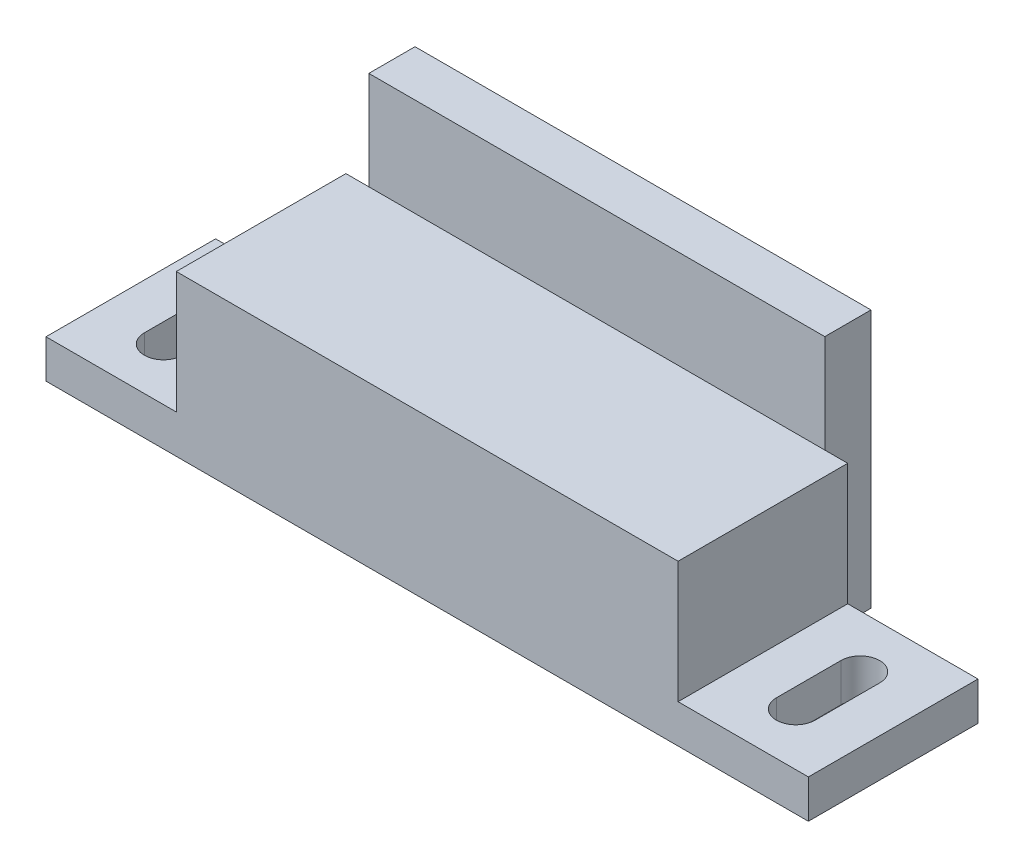
ISO-10303-21;
HEADER;
FILE_DESCRIPTION(('STEP AP214'),'2;1');
FILE_NAME('part.step','',(''),(''),'','','');
FILE_SCHEMA(('AUTOMOTIVE_DESIGN { 1 0 10303 214 1 1 1 1 }'));
ENDSEC;
DATA;
#1=APPLICATION_CONTEXT('core data for automotive mechanical design processes');
#2=APPLICATION_PROTOCOL_DEFINITION('international standard','automotive_design',2000,#1);
#3=PRODUCT_CONTEXT('',#1,'mechanical');
#4=PRODUCT('Part','Part','',(#3));
#5=PRODUCT_RELATED_PRODUCT_CATEGORY('part','',(#4));
#6=PRODUCT_DEFINITION_FORMATION('','',#4);
#7=PRODUCT_DEFINITION_CONTEXT('part definition',#1,'design');
#8=PRODUCT_DEFINITION('design','',#6,#7);
#9=PRODUCT_DEFINITION_SHAPE('','',#8);
#10=(LENGTH_UNIT() NAMED_UNIT(*) SI_UNIT(.MILLI.,.METRE.));
#11=(NAMED_UNIT(*) PLANE_ANGLE_UNIT() SI_UNIT($,.RADIAN.));
#12=(NAMED_UNIT(*) SI_UNIT($,.STERADIAN.) SOLID_ANGLE_UNIT());
#13=UNCERTAINTY_MEASURE_WITH_UNIT(LENGTH_MEASURE(1.E-05),#10,'distance_accuracy_value','');
#14=(GEOMETRIC_REPRESENTATION_CONTEXT(3) GLOBAL_UNCERTAINTY_ASSIGNED_CONTEXT((#13)) GLOBAL_UNIT_ASSIGNED_CONTEXT((#10,
#11,#12)) REPRESENTATION_CONTEXT('',''));
#15=CARTESIAN_POINT('',(0.,0.,0.));
#16=DIRECTION('',(0.,0.,1.));
#17=DIRECTION('',(1.,0.,0.));
#18=AXIS2_PLACEMENT_3D('',#15,#16,#17);
#19=CARTESIAN_POINT('',(0.,0.,-6.1087));
#20=DIRECTION('',(0.,0.,1.));
#21=DIRECTION('',(1.,0.,0.));
#22=AXIS2_PLACEMENT_3D('',#19,#20,#21);
#23=PLANE('',#22);
#24=DIRECTION('',(0.,-1.,0.));
#25=VECTOR('',#24,1.);
#26=CARTESIAN_POINT('',(16.4211,0.,-6.1087));
#27=LINE('',#26,#25);
#28=CARTESIAN_POINT('',(16.4211,11.5316,-6.1087));
#29=VERTEX_POINT('',#28);
#30=CARTESIAN_POINT('',(16.4211,0.,-6.1087));
#31=VERTEX_POINT('',#30);
#32=EDGE_CURVE('E11',#29,#31,#27,.T.);
#33=ORIENTED_EDGE('',*,*,#32,.F.);
#34=DIRECTION('',(-1.,0.,0.));
#35=VECTOR('',#34,1.);
#36=CARTESIAN_POINT('',(18.0721,11.5316,-6.1087));
#37=LINE('',#36,#35);
#38=CARTESIAN_POINT('',(18.0721,11.5316,-6.1087));
#39=VERTEX_POINT('',#38);
#40=EDGE_CURVE('E303',#39,#29,#37,.T.);
#41=ORIENTED_EDGE('',*,*,#40,.F.);
#42=DIRECTION('',(0.,1.,0.));
#43=VECTOR('',#42,1.);
#44=CARTESIAN_POINT('',(18.0721,2.76860000000001,-6.1087));
#45=LINE('',#44,#43);
#46=CARTESIAN_POINT('',(18.0721,2.76860000000001,-6.1087));
#47=VERTEX_POINT('',#46);
#48=EDGE_CURVE('E300',#47,#39,#45,.T.);
#49=ORIENTED_EDGE('',*,*,#48,.F.);
#50=DIRECTION('',(-1.,0.,0.));
#51=VECTOR('',#50,1.);
#52=CARTESIAN_POINT('',(27.4574,2.76860000000001,-6.1087));
#53=LINE('',#52,#51);
#54=CARTESIAN_POINT('',(27.4574,2.76860000000001,-6.1087));
#55=VERTEX_POINT('',#54);
#56=EDGE_CURVE('E298',#55,#47,#53,.T.);
#57=ORIENTED_EDGE('',*,*,#56,.F.);
#58=DIRECTION('',(0.,1.,0.));
#59=VECTOR('',#58,1.);
#60=CARTESIAN_POINT('',(27.4574,0.,-6.1087));
#61=LINE('',#60,#59);
#62=CARTESIAN_POINT('',(27.4574,0.,-6.1087));
#63=VERTEX_POINT('',#62);
#64=EDGE_CURVE('E296',#63,#55,#61,.T.);
#65=ORIENTED_EDGE('',*,*,#64,.F.);
#66=DIRECTION('',(1.,0.,0.));
#67=VECTOR('',#66,1.);
#68=CARTESIAN_POINT('',(-27.4574,0.,-6.1087));
#69=LINE('',#68,#67);
#70=EDGE_CURVE('E52',#31,#63,#69,.T.);
#71=ORIENTED_EDGE('',*,*,#70,.F.);
#72=EDGE_LOOP('',(#33,#41,#49,#57,#65,#71));
#73=FACE_BOUND('',#72,.T.);
#74=ADVANCED_FACE('F35',(#73),#23,.F.);
#75=DIRECTION('',(0.,1.,0.));
#76=VECTOR('',#75,1.);
#77=CARTESIAN_POINT('',(-16.4211,18.6086769877465,-6.1087));
#78=LINE('',#77,#76);
#79=CARTESIAN_POINT('',(-16.4211,0.,-6.1087));
#80=VERTEX_POINT('',#79);
#81=CARTESIAN_POINT('',(-16.4211,11.5316,-6.1087));
#82=VERTEX_POINT('',#81);
#83=EDGE_CURVE('E59',#80,#82,#78,.T.);
#84=ORIENTED_EDGE('',*,*,#83,.F.);
#85=CARTESIAN_POINT('',(-27.4574,0.,-6.1087));
#86=VERTEX_POINT('',#85);
#87=EDGE_CURVE('E294',#86,#80,#69,.T.);
#88=ORIENTED_EDGE('',*,*,#87,.F.);
#89=DIRECTION('',(0.,-1.,0.));
#90=VECTOR('',#89,1.);
#91=CARTESIAN_POINT('',(-27.4574,2.7686,-6.1087));
#92=LINE('',#91,#90);
#93=CARTESIAN_POINT('',(-27.4574,2.7686,-6.1087));
#94=VERTEX_POINT('',#93);
#95=EDGE_CURVE('E238',#94,#86,#92,.T.);
#96=ORIENTED_EDGE('',*,*,#95,.F.);
#97=DIRECTION('',(-1.,0.,0.));
#98=VECTOR('',#97,1.);
#99=CARTESIAN_POINT('',(-18.0721,2.7686,-6.1087));
#100=LINE('',#99,#98);
#101=CARTESIAN_POINT('',(-18.0721,2.7686,-6.1087));
#102=VERTEX_POINT('',#101);
#103=EDGE_CURVE('E277',#102,#94,#100,.T.);
#104=ORIENTED_EDGE('',*,*,#103,.F.);
#105=DIRECTION('',(0.,-1.,0.));
#106=VECTOR('',#105,1.);
#107=CARTESIAN_POINT('',(-18.0721,11.5316,-6.1087));
#108=LINE('',#107,#106);
#109=CARTESIAN_POINT('',(-18.0721,11.5316,-6.1087));
#110=VERTEX_POINT('',#109);
#111=EDGE_CURVE('E306',#110,#102,#108,.T.);
#112=ORIENTED_EDGE('',*,*,#111,.F.);
#113=EDGE_CURVE('E302',#82,#110,#37,.T.);
#114=ORIENTED_EDGE('',*,*,#113,.F.);
#115=EDGE_LOOP('',(#84,#88,#96,#104,#112,#114));
#116=FACE_BOUND('',#115,.T.);
#117=ADVANCED_FACE('F338',(#116),#23,.F.);
#118=CARTESIAN_POINT('',(-27.4574,2.7686,6.1087));
#119=DIRECTION('',(1.,0.,0.));
#120=DIRECTION('',(0.,0.,-1.));
#121=AXIS2_PLACEMENT_3D('',#118,#119,#120);
#122=PLANE('',#121);
#123=ORIENTED_EDGE('',*,*,#95,.T.);
#124=DIRECTION('',(0.,0.,-1.));
#125=VECTOR('',#124,1.);
#126=CARTESIAN_POINT('',(-27.4574,0.,6.1087));
#127=LINE('',#126,#125);
#128=CARTESIAN_POINT('',(-27.4574,0.,6.1087));
#129=VERTEX_POINT('',#128);
#130=EDGE_CURVE('E39',#129,#86,#127,.T.);
#131=ORIENTED_EDGE('',*,*,#130,.F.);
#132=DIRECTION('',(0.,-1.,0.));
#133=VECTOR('',#132,1.);
#134=CARTESIAN_POINT('',(-27.4574,2.7686,6.1087));
#135=LINE('',#134,#133);
#136=CARTESIAN_POINT('',(-27.4574,2.7686,6.1087));
#137=VERTEX_POINT('',#136);
#138=EDGE_CURVE('E273',#137,#129,#135,.T.);
#139=ORIENTED_EDGE('',*,*,#138,.F.);
#140=DIRECTION('',(0.,0.,-1.));
#141=VECTOR('',#140,1.);
#142=CARTESIAN_POINT('',(-27.4574,2.7686,6.1087));
#143=LINE('',#142,#141);
#144=EDGE_CURVE('E291',#137,#94,#143,.T.);
#145=ORIENTED_EDGE('',*,*,#144,.T.);
#146=EDGE_LOOP('',(#123,#131,#139,#145));
#147=FACE_BOUND('',#146,.T.);
#148=ADVANCED_FACE('F37',(#147),#122,.F.);
#149=CARTESIAN_POINT('',(-27.4574,0.,6.1087));
#150=DIRECTION('',(0.,1.,0.));
#151=DIRECTION('',(-1.,0.,0.));
#152=AXIS2_PLACEMENT_3D('',#149,#150,#151);
#153=PLANE('',#152);
#154=DIRECTION('',(0.,0.,-1.));
#155=VECTOR('',#154,1.);
#156=CARTESIAN_POINT('',(-21.36775,0.,-2.3241));
#157=LINE('',#156,#155);
#158=CARTESIAN_POINT('',(-21.36775,0.,2.3241));
#159=VERTEX_POINT('',#158);
#160=CARTESIAN_POINT('',(-21.36775,0.,-2.3241));
#161=VERTEX_POINT('',#160);
#162=EDGE_CURVE('E221',#159,#161,#157,.T.);
#163=ORIENTED_EDGE('',*,*,#162,.T.);
#164=CARTESIAN_POINT('',(-22.76475,0.,-2.3241));
#165=DIRECTION('',(0.,1.,0.));
#166=DIRECTION('',(-1.,0.,0.));
#167=AXIS2_PLACEMENT_3D('',#164,#165,#166);
#168=CIRCLE('',#167,1.397);
#169=CARTESIAN_POINT('',(-24.16175,0.,-2.3241));
#170=VERTEX_POINT('',#169);
#171=EDGE_CURVE('E211',#161,#170,#168,.T.);
#172=ORIENTED_EDGE('',*,*,#171,.T.);
#173=DIRECTION('',(0.,0.,1.));
#174=VECTOR('',#173,1.);
#175=CARTESIAN_POINT('',(-24.16175,0.,-2.3241));
#176=LINE('',#175,#174);
#177=CARTESIAN_POINT('',(-24.16175,0.,2.3241));
#178=VERTEX_POINT('',#177);
#179=EDGE_CURVE('E214',#170,#178,#176,.T.);
#180=ORIENTED_EDGE('',*,*,#179,.T.);
#181=CARTESIAN_POINT('',(-22.76475,0.,2.3241));
#182=DIRECTION('',(0.,1.,0.));
#183=DIRECTION('',(-1.,0.,0.));
#184=AXIS2_PLACEMENT_3D('',#181,#182,#183);
#185=CIRCLE('',#184,1.397);
#186=EDGE_CURVE('E218',#178,#159,#185,.T.);
#187=ORIENTED_EDGE('',*,*,#186,.T.);
#188=EDGE_LOOP('',(#163,#172,#180,#187));
#189=FACE_BOUND('',#188,.T.);
#190=DIRECTION('',(0.,0.,-1.));
#191=VECTOR('',#190,1.);
#192=CARTESIAN_POINT('',(24.16175,0.,-2.3241));
#193=LINE('',#192,#191);
#194=CARTESIAN_POINT('',(24.16175,0.,2.3241));
#195=VERTEX_POINT('',#194);
#196=CARTESIAN_POINT('',(24.16175,0.,-2.3241));
#197=VERTEX_POINT('',#196);
#198=EDGE_CURVE('E255',#195,#197,#193,.T.);
#199=ORIENTED_EDGE('',*,*,#198,.T.);
#200=CARTESIAN_POINT('',(22.76475,0.,-2.3241));
#201=DIRECTION('',(0.,1.,0.));
#202=DIRECTION('',(1.,0.,0.));
#203=AXIS2_PLACEMENT_3D('',#200,#201,#202);
#204=CIRCLE('',#203,1.397);
#205=CARTESIAN_POINT('',(21.36775,0.,-2.3241));
#206=VERTEX_POINT('',#205);
#207=EDGE_CURVE('E245',#197,#206,#204,.T.);
#208=ORIENTED_EDGE('',*,*,#207,.T.);
#209=DIRECTION('',(0.,0.,1.));
#210=VECTOR('',#209,1.);
#211=CARTESIAN_POINT('',(21.36775,0.,-2.3241));
#212=LINE('',#211,#210);
#213=CARTESIAN_POINT('',(21.36775,0.,2.3241));
#214=VERTEX_POINT('',#213);
#215=EDGE_CURVE('E248',#206,#214,#212,.T.);
#216=ORIENTED_EDGE('',*,*,#215,.T.);
#217=CARTESIAN_POINT('',(22.76475,0.,2.3241));
#218=DIRECTION('',(0.,1.,0.));
#219=DIRECTION('',(1.,0.,0.));
#220=AXIS2_PLACEMENT_3D('',#217,#218,#219);
#221=CIRCLE('',#220,1.397);
#222=EDGE_CURVE('E252',#214,#195,#221,.T.);
#223=ORIENTED_EDGE('',*,*,#222,.T.);
#224=EDGE_LOOP('',(#199,#208,#216,#223));
#225=FACE_BOUND('',#224,.T.);
#226=ORIENTED_EDGE('',*,*,#87,.T.);
#227=DIRECTION('',(0.,0.,1.));
#228=VECTOR('',#227,1.);
#229=CARTESIAN_POINT('',(-16.4211,0.,-9.4361));
#230=LINE('',#229,#228);
#231=CARTESIAN_POINT('',(-16.4211,0.,-9.4361));
#232=VERTEX_POINT('',#231);
#233=EDGE_CURVE('E186',#232,#80,#230,.T.);
#234=ORIENTED_EDGE('',*,*,#233,.F.);
#235=DIRECTION('',(-1.,0.,0.));
#236=VECTOR('',#235,1.);
#237=CARTESIAN_POINT('',(16.4211,0.,-9.4361));
#238=LINE('',#237,#236);
#239=CARTESIAN_POINT('',(16.4211,0.,-9.4361));
#240=VERTEX_POINT('',#239);
#241=EDGE_CURVE('E180',#240,#232,#238,.T.);
#242=ORIENTED_EDGE('',*,*,#241,.F.);
#243=DIRECTION('',(0.,0.,1.));
#244=VECTOR('',#243,1.);
#245=CARTESIAN_POINT('',(16.4211,0.,-9.4361));
#246=LINE('',#245,#244);
#247=EDGE_CURVE('E184',#240,#31,#246,.T.);
#248=ORIENTED_EDGE('',*,*,#247,.T.);
#249=ORIENTED_EDGE('',*,*,#70,.T.);
#250=DIRECTION('',(0.,0.,-1.));
#251=VECTOR('',#250,1.);
#252=CARTESIAN_POINT('',(27.4574,0.,6.1087));
#253=LINE('',#252,#251);
#254=CARTESIAN_POINT('',(27.4574,0.,6.1087));
#255=VERTEX_POINT('',#254);
#256=EDGE_CURVE('E326',#255,#63,#253,.T.);
#257=ORIENTED_EDGE('',*,*,#256,.F.);
#258=DIRECTION('',(1.,0.,0.));
#259=VECTOR('',#258,1.);
#260=CARTESIAN_POINT('',(-27.4574,0.,6.1087));
#261=LINE('',#260,#259);
#262=EDGE_CURVE('E276',#129,#255,#261,.T.);
#263=ORIENTED_EDGE('',*,*,#262,.F.);
#264=ORIENTED_EDGE('',*,*,#130,.T.);
#265=EDGE_LOOP('',(#226,#234,#242,#248,#249,#257,#263,#264));
#266=FACE_BOUND('',#265,.T.);
#267=ADVANCED_FACE('F182',(#189,#225,#266),#153,.F.);
#268=CARTESIAN_POINT('',(27.4574,0.,6.1087));
#269=DIRECTION('',(-1.,0.,0.));
#270=DIRECTION('',(0.,0.,1.));
#271=AXIS2_PLACEMENT_3D('',#268,#269,#270);
#272=PLANE('',#271);
#273=ORIENTED_EDGE('',*,*,#64,.T.);
#274=DIRECTION('',(0.,0.,-1.));
#275=VECTOR('',#274,1.);
#276=CARTESIAN_POINT('',(27.4574,2.76860000000001,6.1087));
#277=LINE('',#276,#275);
#278=CARTESIAN_POINT('',(27.4574,2.76860000000001,6.1087));
#279=VERTEX_POINT('',#278);
#280=EDGE_CURVE('E324',#279,#55,#277,.T.);
#281=ORIENTED_EDGE('',*,*,#280,.F.);
#282=DIRECTION('',(0.,1.,0.));
#283=VECTOR('',#282,1.);
#284=CARTESIAN_POINT('',(27.4574,0.,6.1087));
#285=LINE('',#284,#283);
#286=EDGE_CURVE('E279',#255,#279,#285,.T.);
#287=ORIENTED_EDGE('',*,*,#286,.F.);
#288=ORIENTED_EDGE('',*,*,#256,.T.);
#289=EDGE_LOOP('',(#273,#281,#287,#288));
#290=FACE_BOUND('',#289,.T.);
#291=ADVANCED_FACE('F402',(#290),#272,.F.);
#292=CARTESIAN_POINT('',(27.4574,2.76860000000001,6.1087));
#293=DIRECTION('',(0.,-1.,0.));
#294=DIRECTION('',(1.,0.,0.));
#295=AXIS2_PLACEMENT_3D('',#292,#293,#294);
#296=PLANE('',#295);
#297=DIRECTION('',(0.,0.,1.));
#298=VECTOR('',#297,1.);
#299=CARTESIAN_POINT('',(21.36775,2.76860000000002,-2.3241));
#300=LINE('',#299,#298);
#301=CARTESIAN_POINT('',(21.36775,2.76860000000001,-2.3241));
#302=VERTEX_POINT('',#301);
#303=CARTESIAN_POINT('',(21.36775,2.76860000000002,2.3241));
#304=VERTEX_POINT('',#303);
#305=EDGE_CURVE('E205',#302,#304,#300,.T.);
#306=ORIENTED_EDGE('',*,*,#305,.F.);
#307=CARTESIAN_POINT('',(22.76475,2.76860000000003,-2.3241));
#308=DIRECTION('',(0.,1.,0.));
#309=DIRECTION('',(1.,0.,0.));
#310=AXIS2_PLACEMENT_3D('',#307,#308,#309);
#311=CIRCLE('',#310,1.397);
#312=CARTESIAN_POINT('',(24.16175,2.76860000000003,-2.3241));
#313=VERTEX_POINT('',#312);
#314=EDGE_CURVE('E203',#313,#302,#311,.T.);
#315=ORIENTED_EDGE('',*,*,#314,.F.);
#316=DIRECTION('',(0.,0.,-1.));
#317=VECTOR('',#316,1.);
#318=CARTESIAN_POINT('',(24.16175,2.76860000000003,-2.3241));
#319=LINE('',#318,#317);
#320=CARTESIAN_POINT('',(24.16175,2.76860000000003,2.3241));
#321=VERTEX_POINT('',#320);
#322=EDGE_CURVE('E249',#321,#313,#319,.T.);
#323=ORIENTED_EDGE('',*,*,#322,.F.);
#324=CARTESIAN_POINT('',(22.76475,2.76860000000003,2.3241));
#325=DIRECTION('',(0.,1.,0.));
#326=DIRECTION('',(1.,0.,0.));
#327=AXIS2_PLACEMENT_3D('',#324,#325,#326);
#328=CIRCLE('',#327,1.397);
#329=EDGE_CURVE('E261',#304,#321,#328,.T.);
#330=ORIENTED_EDGE('',*,*,#329,.F.);
#331=EDGE_LOOP('',(#306,#315,#323,#330));
#332=FACE_BOUND('',#331,.T.);
#333=ORIENTED_EDGE('',*,*,#56,.T.);
#334=DIRECTION('',(0.,0.,-1.));
#335=VECTOR('',#334,1.);
#336=CARTESIAN_POINT('',(18.0721,2.76860000000001,6.1087));
#337=LINE('',#336,#335);
#338=CARTESIAN_POINT('',(18.0721,2.76860000000001,6.1087));
#339=VERTEX_POINT('',#338);
#340=EDGE_CURVE('E321',#339,#47,#337,.T.);
#341=ORIENTED_EDGE('',*,*,#340,.F.);
#342=DIRECTION('',(-1.,0.,0.));
#343=VECTOR('',#342,1.);
#344=CARTESIAN_POINT('',(27.4574,2.76860000000001,6.1087));
#345=LINE('',#344,#343);
#346=EDGE_CURVE('E281',#279,#339,#345,.T.);
#347=ORIENTED_EDGE('',*,*,#346,.F.);
#348=ORIENTED_EDGE('',*,*,#280,.T.);
#349=EDGE_LOOP('',(#333,#341,#347,#348));
#350=FACE_BOUND('',#349,.T.);
#351=ADVANCED_FACE('F398',(#332,#350),#296,.F.);
#352=CARTESIAN_POINT('',(18.0721,2.76860000000001,6.1087));
#353=DIRECTION('',(-1.,0.,0.));
#354=DIRECTION('',(0.,0.,1.));
#355=AXIS2_PLACEMENT_3D('',#352,#353,#354);
#356=PLANE('',#355);
#357=ORIENTED_EDGE('',*,*,#48,.T.);
#358=DIRECTION('',(0.,0.,-1.));
#359=VECTOR('',#358,1.);
#360=CARTESIAN_POINT('',(18.0721,11.5316,6.1087));
#361=LINE('',#360,#359);
#362=CARTESIAN_POINT('',(18.0721,11.5316,6.1087));
#363=VERTEX_POINT('',#362);
#364=EDGE_CURVE('E318',#363,#39,#361,.T.);
#365=ORIENTED_EDGE('',*,*,#364,.F.);
#366=DIRECTION('',(0.,1.,0.));
#367=VECTOR('',#366,1.);
#368=CARTESIAN_POINT('',(18.0721,2.76860000000001,6.1087));
#369=LINE('',#368,#367);
#370=EDGE_CURVE('E283',#339,#363,#369,.T.);
#371=ORIENTED_EDGE('',*,*,#370,.F.);
#372=ORIENTED_EDGE('',*,*,#340,.T.);
#373=EDGE_LOOP('',(#357,#365,#371,#372));
#374=FACE_BOUND('',#373,.T.);
#375=ADVANCED_FACE('F395',(#374),#356,.F.);
#376=CARTESIAN_POINT('',(18.0721,11.5316,6.1087));
#377=DIRECTION('',(0.,-1.,0.));
#378=DIRECTION('',(0.,0.,-1.));
#379=AXIS2_PLACEMENT_3D('',#376,#377,#378);
#380=PLANE('',#379);
#381=ORIENTED_EDGE('',*,*,#40,.T.);
#382=EDGE_CURVE('E307',#29,#82,#37,.T.);
#383=ORIENTED_EDGE('',*,*,#382,.T.);
#384=ORIENTED_EDGE('',*,*,#113,.T.);
#385=DIRECTION('',(0.,0.,-1.));
#386=VECTOR('',#385,1.);
#387=CARTESIAN_POINT('',(-18.0721,11.5316,6.1087));
#388=LINE('',#387,#386);
#389=CARTESIAN_POINT('',(-18.0721,11.5316,6.1087));
#390=VERTEX_POINT('',#389);
#391=EDGE_CURVE('E315',#390,#110,#388,.T.);
#392=ORIENTED_EDGE('',*,*,#391,.F.);
#393=DIRECTION('',(-1.,0.,0.));
#394=VECTOR('',#393,1.);
#395=CARTESIAN_POINT('',(18.0721,11.5316,6.1087));
#396=LINE('',#395,#394);
#397=EDGE_CURVE('E285',#363,#390,#396,.T.);
#398=ORIENTED_EDGE('',*,*,#397,.F.);
#399=ORIENTED_EDGE('',*,*,#364,.T.);
#400=EDGE_LOOP('',(#381,#383,#384,#392,#398,#399));
#401=FACE_BOUND('',#400,.T.);
#402=ADVANCED_FACE('F350',(#401),#380,.F.);
#403=CARTESIAN_POINT('',(-18.0721,11.5316,6.1087));
#404=DIRECTION('',(1.,0.,0.));
#405=DIRECTION('',(0.,0.,-1.));
#406=AXIS2_PLACEMENT_3D('',#403,#404,#405);
#407=PLANE('',#406);
#408=ORIENTED_EDGE('',*,*,#111,.T.);
#409=DIRECTION('',(0.,0.,-1.));
#410=VECTOR('',#409,1.);
#411=CARTESIAN_POINT('',(-18.0721,2.7686,6.1087));
#412=LINE('',#411,#410);
#413=CARTESIAN_POINT('',(-18.0721,2.7686,6.1087));
#414=VERTEX_POINT('',#413);
#415=EDGE_CURVE('E312',#414,#102,#412,.T.);
#416=ORIENTED_EDGE('',*,*,#415,.F.);
#417=DIRECTION('',(0.,-1.,0.));
#418=VECTOR('',#417,1.);
#419=CARTESIAN_POINT('',(-18.0721,11.5316,6.1087));
#420=LINE('',#419,#418);
#421=EDGE_CURVE('E287',#390,#414,#420,.T.);
#422=ORIENTED_EDGE('',*,*,#421,.F.);
#423=ORIENTED_EDGE('',*,*,#391,.T.);
#424=EDGE_LOOP('',(#408,#416,#422,#423));
#425=FACE_BOUND('',#424,.T.);
#426=ADVANCED_FACE('F346',(#425),#407,.F.);
#427=CARTESIAN_POINT('',(-18.0721,2.7686,6.1087));
#428=DIRECTION('',(0.,-1.,0.));
#429=DIRECTION('',(1.,0.,0.));
#430=AXIS2_PLACEMENT_3D('',#427,#428,#429);
#431=PLANE('',#430);
#432=DIRECTION('',(0.,0.,1.));
#433=VECTOR('',#432,1.);
#434=CARTESIAN_POINT('',(-24.16175,2.7686,-2.3241));
#435=LINE('',#434,#433);
#436=CARTESIAN_POINT('',(-24.16175,2.7686,-2.3241));
#437=VERTEX_POINT('',#436);
#438=CARTESIAN_POINT('',(-24.16175,2.7686,2.3241));
#439=VERTEX_POINT('',#438);
#440=EDGE_CURVE('E227',#437,#439,#435,.T.);
#441=ORIENTED_EDGE('',*,*,#440,.F.);
#442=CARTESIAN_POINT('',(-22.76475,2.7686,-2.3241));
#443=DIRECTION('',(0.,1.,0.));
#444=DIRECTION('',(-1.,0.,0.));
#445=AXIS2_PLACEMENT_3D('',#442,#443,#444);
#446=CIRCLE('',#445,1.397);
#447=CARTESIAN_POINT('',(-21.36775,2.7686,-2.3241));
#448=VERTEX_POINT('',#447);
#449=EDGE_CURVE('E225',#448,#437,#446,.T.);
#450=ORIENTED_EDGE('',*,*,#449,.F.);
#451=DIRECTION('',(0.,0.,-1.));
#452=VECTOR('',#451,1.);
#453=CARTESIAN_POINT('',(-21.36775,2.7686,-2.3241));
#454=LINE('',#453,#452);
#455=CARTESIAN_POINT('',(-21.36775,2.7686,2.3241));
#456=VERTEX_POINT('',#455);
#457=EDGE_CURVE('E215',#456,#448,#454,.T.);
#458=ORIENTED_EDGE('',*,*,#457,.F.);
#459=CARTESIAN_POINT('',(-22.76475,2.7686,2.3241));
#460=DIRECTION('',(0.,1.,0.));
#461=DIRECTION('',(-1.,0.,0.));
#462=AXIS2_PLACEMENT_3D('',#459,#460,#461);
#463=CIRCLE('',#462,1.397);
#464=EDGE_CURVE('E231',#439,#456,#463,.T.);
#465=ORIENTED_EDGE('',*,*,#464,.F.);
#466=EDGE_LOOP('',(#441,#450,#458,#465));
#467=FACE_BOUND('',#466,.T.);
#468=ORIENTED_EDGE('',*,*,#103,.T.);
#469=ORIENTED_EDGE('',*,*,#144,.F.);
#470=DIRECTION('',(-1.,0.,0.));
#471=VECTOR('',#470,1.);
#472=CARTESIAN_POINT('',(-18.0721,2.7686,6.1087));
#473=LINE('',#472,#471);
#474=EDGE_CURVE('E289',#414,#137,#473,.T.);
#475=ORIENTED_EDGE('',*,*,#474,.F.);
#476=ORIENTED_EDGE('',*,*,#415,.T.);
#477=EDGE_LOOP('',(#468,#469,#475,#476));
#478=FACE_BOUND('',#477,.T.);
#479=ADVANCED_FACE('F341',(#467,#478),#431,.F.);
#480=CARTESIAN_POINT('',(0.,0.,6.1087));
#481=DIRECTION('',(0.,0.,1.));
#482=DIRECTION('',(1.,0.,0.));
#483=AXIS2_PLACEMENT_3D('',#480,#481,#482);
#484=PLANE('',#483);
#485=ORIENTED_EDGE('',*,*,#138,.T.);
#486=ORIENTED_EDGE('',*,*,#262,.T.);
#487=ORIENTED_EDGE('',*,*,#286,.T.);
#488=ORIENTED_EDGE('',*,*,#346,.T.);
#489=ORIENTED_EDGE('',*,*,#370,.T.);
#490=ORIENTED_EDGE('',*,*,#397,.T.);
#491=ORIENTED_EDGE('',*,*,#421,.T.);
#492=ORIENTED_EDGE('',*,*,#474,.T.);
#493=EDGE_LOOP('',(#485,#486,#487,#488,#489,#490,#491,#492));
#494=FACE_BOUND('',#493,.T.);
#495=ADVANCED_FACE('F386',(#494),#484,.T.);
#496=CARTESIAN_POINT('',(-22.76475,0.,-2.3241));
#497=DIRECTION('',(0.,1.,0.));
#498=DIRECTION('',(-1.,0.,0.));
#499=AXIS2_PLACEMENT_3D('',#496,#497,#498);
#500=CYLINDRICAL_SURFACE('',#499,1.397);
#501=ORIENTED_EDGE('',*,*,#449,.T.);
#502=DIRECTION('',(0.,1.,0.));
#503=VECTOR('',#502,1.);
#504=CARTESIAN_POINT('',(-24.16175,0.,-2.3241));
#505=LINE('',#504,#503);
#506=EDGE_CURVE('E224',#170,#437,#505,.T.);
#507=ORIENTED_EDGE('',*,*,#506,.F.);
#508=ORIENTED_EDGE('',*,*,#171,.F.);
#509=DIRECTION('',(0.,1.,0.));
#510=VECTOR('',#509,1.);
#511=CARTESIAN_POINT('',(-21.36775,0.,-2.3241));
#512=LINE('',#511,#510);
#513=EDGE_CURVE('E236',#161,#448,#512,.T.);
#514=ORIENTED_EDGE('',*,*,#513,.T.);
#515=EDGE_LOOP('',(#501,#507,#508,#514));
#516=FACE_BOUND('',#515,.T.);
#517=ADVANCED_FACE('F439',(#516),#500,.F.);
#518=CARTESIAN_POINT('',(-21.36775,0.,-2.3241));
#519=DIRECTION('',(1.,0.,0.));
#520=DIRECTION('',(0.,1.,0.));
#521=AXIS2_PLACEMENT_3D('',#518,#519,#520);
#522=PLANE('',#521);
#523=ORIENTED_EDGE('',*,*,#457,.T.);
#524=ORIENTED_EDGE('',*,*,#513,.F.);
#525=ORIENTED_EDGE('',*,*,#162,.F.);
#526=DIRECTION('',(0.,1.,0.));
#527=VECTOR('',#526,1.);
#528=CARTESIAN_POINT('',(-21.36775,0.,2.3241));
#529=LINE('',#528,#527);
#530=EDGE_CURVE('E239',#159,#456,#529,.T.);
#531=ORIENTED_EDGE('',*,*,#530,.T.);
#532=EDGE_LOOP('',(#523,#524,#525,#531));
#533=FACE_BOUND('',#532,.T.);
#534=ADVANCED_FACE('F443',(#533),#522,.F.);
#535=CARTESIAN_POINT('',(-22.76475,0.,2.3241));
#536=DIRECTION('',(0.,1.,0.));
#537=DIRECTION('',(-1.,0.,0.));
#538=AXIS2_PLACEMENT_3D('',#535,#536,#537);
#539=CYLINDRICAL_SURFACE('',#538,1.397);
#540=ORIENTED_EDGE('',*,*,#464,.T.);
#541=ORIENTED_EDGE('',*,*,#530,.F.);
#542=ORIENTED_EDGE('',*,*,#186,.F.);
#543=DIRECTION('',(0.,1.,0.));
#544=VECTOR('',#543,1.);
#545=CARTESIAN_POINT('',(-24.16175,0.,2.3241));
#546=LINE('',#545,#544);
#547=EDGE_CURVE('E241',#178,#439,#546,.T.);
#548=ORIENTED_EDGE('',*,*,#547,.T.);
#549=EDGE_LOOP('',(#540,#541,#542,#548));
#550=FACE_BOUND('',#549,.T.);
#551=ADVANCED_FACE('F449',(#550),#539,.F.);
#552=CARTESIAN_POINT('',(-24.16175,0.,-2.3241));
#553=DIRECTION('',(-1.,0.,0.));
#554=DIRECTION('',(0.,-1.,0.));
#555=AXIS2_PLACEMENT_3D('',#552,#553,#554);
#556=PLANE('',#555);
#557=ORIENTED_EDGE('',*,*,#440,.T.);
#558=ORIENTED_EDGE('',*,*,#547,.F.);
#559=ORIENTED_EDGE('',*,*,#179,.F.);
#560=ORIENTED_EDGE('',*,*,#506,.T.);
#561=EDGE_LOOP('',(#557,#558,#559,#560));
#562=FACE_BOUND('',#561,.T.);
#563=ADVANCED_FACE('F454',(#562),#556,.F.);
#564=CARTESIAN_POINT('',(22.76475,0.,-2.3241));
#565=DIRECTION('',(0.,1.,0.));
#566=DIRECTION('',(-1.,0.,0.));
#567=AXIS2_PLACEMENT_3D('',#564,#565,#566);
#568=CYLINDRICAL_SURFACE('',#567,1.397);
#569=ORIENTED_EDGE('',*,*,#314,.T.);
#570=DIRECTION('',(0.,1.,0.));
#571=VECTOR('',#570,1.);
#572=CARTESIAN_POINT('',(21.36775,0.,-2.3241));
#573=LINE('',#572,#571);
#574=EDGE_CURVE('E257',#206,#302,#573,.T.);
#575=ORIENTED_EDGE('',*,*,#574,.F.);
#576=ORIENTED_EDGE('',*,*,#207,.F.);
#577=DIRECTION('',(0.,1.,0.));
#578=VECTOR('',#577,1.);
#579=CARTESIAN_POINT('',(24.16175,0.,-2.3241));
#580=LINE('',#579,#578);
#581=EDGE_CURVE('E228',#197,#313,#580,.T.);
#582=ORIENTED_EDGE('',*,*,#581,.T.);
#583=EDGE_LOOP('',(#569,#575,#576,#582));
#584=FACE_BOUND('',#583,.T.);
#585=ADVANCED_FACE('F419',(#584),#568,.F.);
#586=CARTESIAN_POINT('',(24.16175,0.,-2.3241));
#587=DIRECTION('',(1.,0.,0.));
#588=DIRECTION('',(0.,1.,0.));
#589=AXIS2_PLACEMENT_3D('',#586,#587,#588);
#590=PLANE('',#589);
#591=ORIENTED_EDGE('',*,*,#322,.T.);
#592=ORIENTED_EDGE('',*,*,#581,.F.);
#593=ORIENTED_EDGE('',*,*,#198,.F.);
#594=DIRECTION('',(0.,1.,0.));
#595=VECTOR('',#594,1.);
#596=CARTESIAN_POINT('',(24.16175,0.,2.3241));
#597=LINE('',#596,#595);
#598=EDGE_CURVE('E267',#195,#321,#597,.T.);
#599=ORIENTED_EDGE('',*,*,#598,.T.);
#600=EDGE_LOOP('',(#591,#592,#593,#599));
#601=FACE_BOUND('',#600,.T.);
#602=ADVANCED_FACE('F415',(#601),#590,.F.);
#603=CARTESIAN_POINT('',(22.76475,0.,2.3241));
#604=DIRECTION('',(0.,1.,0.));
#605=DIRECTION('',(-1.,0.,0.));
#606=AXIS2_PLACEMENT_3D('',#603,#604,#605);
#607=CYLINDRICAL_SURFACE('',#606,1.397);
#608=ORIENTED_EDGE('',*,*,#329,.T.);
#609=ORIENTED_EDGE('',*,*,#598,.F.);
#610=ORIENTED_EDGE('',*,*,#222,.F.);
#611=DIRECTION('',(0.,1.,0.));
#612=VECTOR('',#611,1.);
#613=CARTESIAN_POINT('',(21.36775,0.,2.3241));
#614=LINE('',#613,#612);
#615=EDGE_CURVE('E269',#214,#304,#614,.T.);
#616=ORIENTED_EDGE('',*,*,#615,.T.);
#617=EDGE_LOOP('',(#608,#609,#610,#616));
#618=FACE_BOUND('',#617,.T.);
#619=ADVANCED_FACE('F427',(#618),#607,.F.);
#620=CARTESIAN_POINT('',(21.36775,0.,-2.3241));
#621=DIRECTION('',(-1.,0.,0.));
#622=DIRECTION('',(0.,-1.,0.));
#623=AXIS2_PLACEMENT_3D('',#620,#621,#622);
#624=PLANE('',#623);
#625=ORIENTED_EDGE('',*,*,#305,.T.);
#626=ORIENTED_EDGE('',*,*,#615,.F.);
#627=ORIENTED_EDGE('',*,*,#215,.F.);
#628=ORIENTED_EDGE('',*,*,#574,.T.);
#629=EDGE_LOOP('',(#625,#626,#627,#628));
#630=FACE_BOUND('',#629,.T.);
#631=ADVANCED_FACE('F424',(#630),#624,.F.);
#632=CARTESIAN_POINT('',(0.,0.,-6.1087));
#633=DIRECTION('',(0.,0.,1.));
#634=DIRECTION('',(1.,0.,0.));
#635=AXIS2_PLACEMENT_3D('',#632,#633,#634);
#636=PLANE('',#635);
#637=ORIENTED_EDGE('',*,*,#382,.F.);
#638=CARTESIAN_POINT('',(16.4211,18.6086769877465,-6.1087));
#639=VERTEX_POINT('',#638);
#640=EDGE_CURVE('E45',#639,#29,#27,.T.);
#641=ORIENTED_EDGE('',*,*,#640,.F.);
#642=DIRECTION('',(1.,0.,0.));
#643=VECTOR('',#642,1.);
#644=CARTESIAN_POINT('',(16.4211,18.6086769877465,-6.1087));
#645=LINE('',#644,#643);
#646=CARTESIAN_POINT('',(-16.4211,18.6086769877465,-6.1087));
#647=VERTEX_POINT('',#646);
#648=EDGE_CURVE('E199',#647,#639,#645,.T.);
#649=ORIENTED_EDGE('',*,*,#648,.F.);
#650=EDGE_CURVE('E355',#82,#647,#78,.T.);
#651=ORIENTED_EDGE('',*,*,#650,.F.);
#652=EDGE_LOOP('',(#637,#641,#649,#651));
#653=FACE_BOUND('',#652,.T.);
#654=ADVANCED_FACE('F356',(#653),#636,.T.);
#655=CARTESIAN_POINT('',(16.4211,0.,-9.4361));
#656=DIRECTION('',(-1.,0.,0.));
#657=DIRECTION('',(0.,0.,1.));
#658=AXIS2_PLACEMENT_3D('',#655,#656,#657);
#659=PLANE('',#658);
#660=ORIENTED_EDGE('',*,*,#640,.T.);
#661=ORIENTED_EDGE('',*,*,#32,.T.);
#662=ORIENTED_EDGE('',*,*,#247,.F.);
#663=DIRECTION('',(0.,-1.,0.));
#664=VECTOR('',#663,1.);
#665=CARTESIAN_POINT('',(16.4211,0.,-9.4361));
#666=LINE('',#665,#664);
#667=CARTESIAN_POINT('',(16.4211,18.6086769877465,-9.4361));
#668=VERTEX_POINT('',#667);
#669=EDGE_CURVE('E190',#668,#240,#666,.T.);
#670=ORIENTED_EDGE('',*,*,#669,.F.);
#671=DIRECTION('',(0.,0.,1.));
#672=VECTOR('',#671,1.);
#673=CARTESIAN_POINT('',(16.4211,18.6086769877465,-9.4361));
#674=LINE('',#673,#672);
#675=EDGE_CURVE('E366',#668,#639,#674,.T.);
#676=ORIENTED_EDGE('',*,*,#675,.T.);
#677=EDGE_LOOP('',(#660,#661,#662,#670,#676));
#678=FACE_BOUND('',#677,.T.);
#679=ADVANCED_FACE('F202',(#678),#659,.F.);
#680=CARTESIAN_POINT('',(-16.4211,18.6086769877465,-9.4361));
#681=DIRECTION('',(1.,0.,0.));
#682=DIRECTION('',(0.,0.,-1.));
#683=AXIS2_PLACEMENT_3D('',#680,#681,#682);
#684=PLANE('',#683);
#685=ORIENTED_EDGE('',*,*,#83,.T.);
#686=ORIENTED_EDGE('',*,*,#650,.T.);
#687=DIRECTION('',(0.,0.,1.));
#688=VECTOR('',#687,1.);
#689=CARTESIAN_POINT('',(-16.4211,18.6086769877465,-9.4361));
#690=LINE('',#689,#688);
#691=CARTESIAN_POINT('',(-16.4211,18.6086769877465,-9.4361));
#692=VERTEX_POINT('',#691);
#693=EDGE_CURVE('E207',#692,#647,#690,.T.);
#694=ORIENTED_EDGE('',*,*,#693,.F.);
#695=DIRECTION('',(0.,1.,0.));
#696=VECTOR('',#695,1.);
#697=CARTESIAN_POINT('',(-16.4211,18.6086769877465,-9.4361));
#698=LINE('',#697,#696);
#699=EDGE_CURVE('E189',#232,#692,#698,.T.);
#700=ORIENTED_EDGE('',*,*,#699,.F.);
#701=ORIENTED_EDGE('',*,*,#233,.T.);
#702=EDGE_LOOP('',(#685,#686,#694,#700,#701));
#703=FACE_BOUND('',#702,.T.);
#704=ADVANCED_FACE('F362',(#703),#684,.F.);
#705=CARTESIAN_POINT('',(16.4211,18.6086769877465,-9.4361));
#706=DIRECTION('',(0.,-1.,0.));
#707=DIRECTION('',(0.,0.,-1.));
#708=AXIS2_PLACEMENT_3D('',#705,#706,#707);
#709=PLANE('',#708);
#710=ORIENTED_EDGE('',*,*,#648,.T.);
#711=ORIENTED_EDGE('',*,*,#675,.F.);
#712=DIRECTION('',(1.,0.,0.));
#713=VECTOR('',#712,1.);
#714=CARTESIAN_POINT('',(16.4211,18.6086769877465,-9.4361));
#715=LINE('',#714,#713);
#716=EDGE_CURVE('E195',#692,#668,#715,.T.);
#717=ORIENTED_EDGE('',*,*,#716,.F.);
#718=ORIENTED_EDGE('',*,*,#693,.T.);
#719=EDGE_LOOP('',(#710,#711,#717,#718));
#720=FACE_BOUND('',#719,.T.);
#721=ADVANCED_FACE('F368',(#720),#709,.F.);
#722=CARTESIAN_POINT('',(0.,0.,-9.4361));
#723=DIRECTION('',(0.,0.,1.));
#724=DIRECTION('',(1.,0.,0.));
#725=AXIS2_PLACEMENT_3D('',#722,#723,#724);
#726=PLANE('',#725);
#727=ORIENTED_EDGE('',*,*,#669,.T.);
#728=ORIENTED_EDGE('',*,*,#241,.T.);
#729=ORIENTED_EDGE('',*,*,#699,.T.);
#730=ORIENTED_EDGE('',*,*,#716,.T.);
#731=EDGE_LOOP('',(#727,#728,#729,#730));
#732=FACE_BOUND('',#731,.T.);
#733=ADVANCED_FACE('F193',(#732),#726,.F.);
#734=CLOSED_SHELL('',(#74,#117,#148,#267,#291,#351,#375,#402,#426,#479,#495,#517,#534,#551,#563,
#585,#602,#619,#631,#654,#679,#704,#721,#733));
#735=MANIFOLD_SOLID_BREP('B2',#734);
#736=ADVANCED_BREP_SHAPE_REPRESENTATION('',(#18,#735),#14);
#737=SHAPE_DEFINITION_REPRESENTATION(#9,#736);
ENDSEC;
END-ISO-10303-21;
